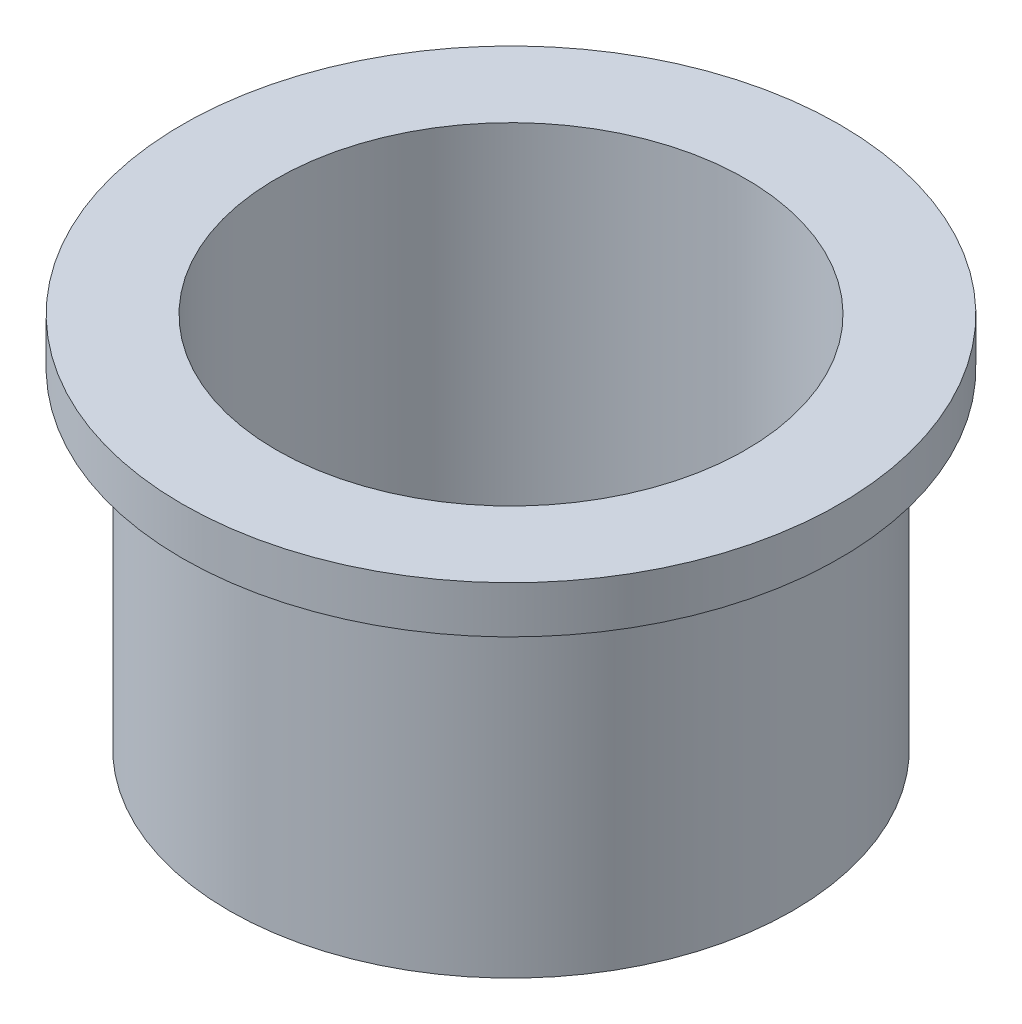
ISO-10303-21;
HEADER;
FILE_DESCRIPTION(('STEP AP214'),'2;1');
FILE_NAME('part.step','',(''),(''),'','','');
FILE_SCHEMA(('AUTOMOTIVE_DESIGN { 1 0 10303 214 1 1 1 1 }'));
ENDSEC;
DATA;
#1=APPLICATION_CONTEXT('core data for automotive mechanical design processes');
#2=APPLICATION_PROTOCOL_DEFINITION('international standard','automotive_design',2000,#1);
#3=PRODUCT_CONTEXT('',#1,'mechanical');
#4=PRODUCT('Part','Part','',(#3));
#5=PRODUCT_RELATED_PRODUCT_CATEGORY('part','',(#4));
#6=PRODUCT_DEFINITION_FORMATION('','',#4);
#7=PRODUCT_DEFINITION_CONTEXT('part definition',#1,'design');
#8=PRODUCT_DEFINITION('design','',#6,#7);
#9=PRODUCT_DEFINITION_SHAPE('','',#8);
#10=(LENGTH_UNIT() NAMED_UNIT(*) SI_UNIT(.MILLI.,.METRE.));
#11=(NAMED_UNIT(*) PLANE_ANGLE_UNIT() SI_UNIT($,.RADIAN.));
#12=(NAMED_UNIT(*) SI_UNIT($,.STERADIAN.) SOLID_ANGLE_UNIT());
#13=UNCERTAINTY_MEASURE_WITH_UNIT(LENGTH_MEASURE(1.E-05),#10,'distance_accuracy_value','');
#14=(GEOMETRIC_REPRESENTATION_CONTEXT(3) GLOBAL_UNCERTAINTY_ASSIGNED_CONTEXT((#13)) GLOBAL_UNIT_ASSIGNED_CONTEXT((#10,
#11,#12)) REPRESENTATION_CONTEXT('',''));
#15=CARTESIAN_POINT('',(0.,0.,0.));
#16=DIRECTION('',(0.,0.,1.));
#17=DIRECTION('',(1.,0.,0.));
#18=AXIS2_PLACEMENT_3D('',#15,#16,#17);
#19=CARTESIAN_POINT('',(0.,20.,0.));
#20=DIRECTION('',(0.,-1.,0.));
#21=DIRECTION('',(0.,0.,-1.));
#22=AXIS2_PLACEMENT_3D('',#19,#20,#21);
#23=CYLINDRICAL_SURFACE('',#22,15.);
#24=CARTESIAN_POINT('',(0.,0.,0.));
#25=DIRECTION('',(0.,1.,0.));
#26=DIRECTION('',(0.,0.,1.));
#27=AXIS2_PLACEMENT_3D('',#24,#25,#26);
#28=CIRCLE('',#27,15.);
#29=CARTESIAN_POINT('',(0.,0.,15.));
#30=VERTEX_POINT('',#29);
#31=EDGE_CURVE('E43',#30,#30,#28,.T.);
#32=ORIENTED_EDGE('',*,*,#31,.T.);
#33=EDGE_LOOP('',(#32));
#34=FACE_BOUND('',#33,.T.);
#35=CARTESIAN_POINT('',(0.,17.5,0.));
#36=DIRECTION('',(0.,1.,0.));
#37=DIRECTION('',(0.,0.,1.));
#38=AXIS2_PLACEMENT_3D('',#35,#36,#37);
#39=CIRCLE('',#38,15.);
#40=CARTESIAN_POINT('',(0.,17.5,15.));
#41=VERTEX_POINT('',#40);
#42=EDGE_CURVE('E10',#41,#41,#39,.T.);
#43=ORIENTED_EDGE('',*,*,#42,.F.);
#44=EDGE_LOOP('',(#43));
#45=FACE_BOUND('',#44,.T.);
#46=ADVANCED_FACE('F37',(#34,#45),#23,.T.);
#47=CARTESIAN_POINT('',(0.,20.,0.));
#48=DIRECTION('',(0.,1.,0.));
#49=DIRECTION('',(0.,0.,1.));
#50=AXIS2_PLACEMENT_3D('',#47,#48,#49);
#51=PLANE('',#50);
#52=CARTESIAN_POINT('',(0.,20.,0.));
#53=DIRECTION('',(0.,1.,0.));
#54=DIRECTION('',(0.,0.,1.));
#55=AXIS2_PLACEMENT_3D('',#52,#53,#54);
#56=CIRCLE('',#55,12.5);
#57=CARTESIAN_POINT('',(0.,20.,12.5));
#58=VERTEX_POINT('',#57);
#59=EDGE_CURVE('E47',#58,#58,#56,.T.);
#60=ORIENTED_EDGE('',*,*,#59,.F.);
#61=EDGE_LOOP('',(#60));
#62=FACE_BOUND('',#61,.T.);
#63=CARTESIAN_POINT('',(0.,20.,0.));
#64=DIRECTION('',(0.,1.,0.));
#65=DIRECTION('',(0.,0.,1.));
#66=AXIS2_PLACEMENT_3D('',#63,#64,#65);
#67=CIRCLE('',#66,17.5);
#68=CARTESIAN_POINT('',(0.,20.,17.5));
#69=VERTEX_POINT('',#68);
#70=EDGE_CURVE('E57',#69,#69,#67,.T.);
#71=ORIENTED_EDGE('',*,*,#70,.T.);
#72=EDGE_LOOP('',(#71));
#73=FACE_BOUND('',#72,.T.);
#74=ADVANCED_FACE('F75',(#62,#73),#51,.T.);
#75=CARTESIAN_POINT('',(0.,0.,0.));
#76=DIRECTION('',(0.,1.,0.));
#77=DIRECTION('',(0.,0.,1.));
#78=AXIS2_PLACEMENT_3D('',#75,#76,#77);
#79=PLANE('',#78);
#80=ORIENTED_EDGE('',*,*,#31,.F.);
#81=EDGE_LOOP('',(#80));
#82=FACE_BOUND('',#81,.T.);
#83=CARTESIAN_POINT('',(0.,0.,0.));
#84=DIRECTION('',(0.,1.,0.));
#85=DIRECTION('',(0.,0.,1.));
#86=AXIS2_PLACEMENT_3D('',#83,#84,#85);
#87=CIRCLE('',#86,12.5);
#88=CARTESIAN_POINT('',(0.,0.,12.5));
#89=VERTEX_POINT('',#88);
#90=EDGE_CURVE('E51',#89,#89,#87,.T.);
#91=ORIENTED_EDGE('',*,*,#90,.T.);
#92=EDGE_LOOP('',(#91));
#93=FACE_BOUND('',#92,.T.);
#94=ADVANCED_FACE('F80',(#82,#93),#79,.F.);
#95=CARTESIAN_POINT('',(0.,20.,0.));
#96=DIRECTION('',(0.,-1.,0.));
#97=DIRECTION('',(0.,0.,-1.));
#98=AXIS2_PLACEMENT_3D('',#95,#96,#97);
#99=CYLINDRICAL_SURFACE('',#98,12.5);
#100=ORIENTED_EDGE('',*,*,#59,.T.);
#101=EDGE_LOOP('',(#100));
#102=FACE_BOUND('',#101,.T.);
#103=ORIENTED_EDGE('',*,*,#90,.F.);
#104=EDGE_LOOP('',(#103));
#105=FACE_BOUND('',#104,.T.);
#106=ADVANCED_FACE('F72',(#102,#105),#99,.F.);
#107=CARTESIAN_POINT('',(0.,17.5,0.));
#108=DIRECTION('',(0.,1.,0.));
#109=DIRECTION('',(0.,0.,1.));
#110=AXIS2_PLACEMENT_3D('',#107,#108,#109);
#111=CYLINDRICAL_SURFACE('',#110,17.5);
#112=CARTESIAN_POINT('',(0.,17.5,0.));
#113=DIRECTION('',(0.,1.,0.));
#114=DIRECTION('',(0.,0.,1.));
#115=AXIS2_PLACEMENT_3D('',#112,#113,#114);
#116=CIRCLE('',#115,17.5);
#117=CARTESIAN_POINT('',(0.,17.5,17.5));
#118=VERTEX_POINT('',#117);
#119=EDGE_CURVE('E55',#118,#118,#116,.T.);
#120=ORIENTED_EDGE('',*,*,#119,.T.);
#121=EDGE_LOOP('',(#120));
#122=FACE_BOUND('',#121,.T.);
#123=ORIENTED_EDGE('',*,*,#70,.F.);
#124=EDGE_LOOP('',(#123));
#125=FACE_BOUND('',#124,.T.);
#126=ADVANCED_FACE('F63',(#122,#125),#111,.T.);
#127=CARTESIAN_POINT('',(0.,17.5,0.));
#128=DIRECTION('',(0.,1.,0.));
#129=DIRECTION('',(0.,0.,1.));
#130=AXIS2_PLACEMENT_3D('',#127,#128,#129);
#131=PLANE('',#130);
#132=ORIENTED_EDGE('',*,*,#42,.T.);
#133=EDGE_LOOP('',(#132));
#134=FACE_BOUND('',#133,.T.);
#135=ORIENTED_EDGE('',*,*,#119,.F.);
#136=EDGE_LOOP('',(#135));
#137=FACE_BOUND('',#136,.T.);
#138=ADVANCED_FACE('F66',(#134,#137),#131,.F.);
#139=CLOSED_SHELL('',(#46,#74,#94,#106,#126,#138));
#140=MANIFOLD_SOLID_BREP('B2',#139);
#141=ADVANCED_BREP_SHAPE_REPRESENTATION('',(#18,#140),#14);
#142=SHAPE_DEFINITION_REPRESENTATION(#9,#141);
ENDSEC;
END-ISO-10303-21;
